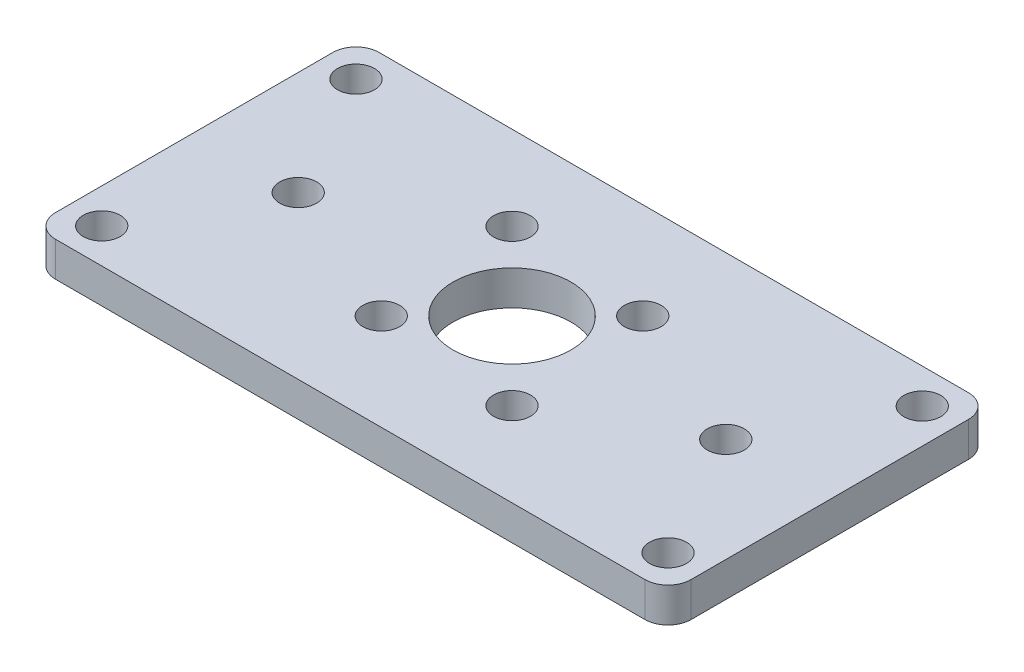
ISO-10303-21;
HEADER;
FILE_DESCRIPTION(('STEP AP214'),'2;1');
FILE_NAME('part.step','',(''),(''),'','','');
FILE_SCHEMA(('AUTOMOTIVE_DESIGN { 1 0 10303 214 1 1 1 1 }'));
ENDSEC;
DATA;
#1=APPLICATION_CONTEXT('core data for automotive mechanical design processes');
#2=APPLICATION_PROTOCOL_DEFINITION('international standard','automotive_design',2000,#1);
#3=PRODUCT_CONTEXT('',#1,'mechanical');
#4=PRODUCT('Part','Part','',(#3));
#5=PRODUCT_RELATED_PRODUCT_CATEGORY('part','',(#4));
#6=PRODUCT_DEFINITION_FORMATION('','',#4);
#7=PRODUCT_DEFINITION_CONTEXT('part definition',#1,'design');
#8=PRODUCT_DEFINITION('design','',#6,#7);
#9=PRODUCT_DEFINITION_SHAPE('','',#8);
#10=(LENGTH_UNIT() NAMED_UNIT(*) SI_UNIT(.MILLI.,.METRE.));
#11=(NAMED_UNIT(*) PLANE_ANGLE_UNIT() SI_UNIT($,.RADIAN.));
#12=(NAMED_UNIT(*) SI_UNIT($,.STERADIAN.) SOLID_ANGLE_UNIT());
#13=UNCERTAINTY_MEASURE_WITH_UNIT(LENGTH_MEASURE(1.E-05),#10,'distance_accuracy_value','');
#14=(GEOMETRIC_REPRESENTATION_CONTEXT(3) GLOBAL_UNCERTAINTY_ASSIGNED_CONTEXT((#13)) GLOBAL_UNIT_ASSIGNED_CONTEXT((#10,
#11,#12)) REPRESENTATION_CONTEXT('',''));
#15=CARTESIAN_POINT('',(0.,0.,0.));
#16=DIRECTION('',(0.,0.,1.));
#17=DIRECTION('',(1.,0.,0.));
#18=AXIS2_PLACEMENT_3D('',#15,#16,#17);
#19=CARTESIAN_POINT('',(0.,3.,0.));
#20=DIRECTION('',(0.,-1.,0.));
#21=DIRECTION('',(0.,0.,-1.));
#22=AXIS2_PLACEMENT_3D('',#19,#20,#21);
#23=PLANE('',#22);
#24=CARTESIAN_POINT('',(24.5,3.,11.));
#25=DIRECTION('',(0.,1.,0.));
#26=DIRECTION('',(0.,0.,-1.));
#27=AXIS2_PLACEMENT_3D('',#24,#25,#26);
#28=CIRCLE('',#27,1.6);
#29=CARTESIAN_POINT('',(24.5,3.,9.39999999999998));
#30=VERTEX_POINT('',#29);
#31=EDGE_CURVE('E276',#30,#30,#28,.T.);
#32=ORIENTED_EDGE('',*,*,#31,.F.);
#33=EDGE_LOOP('',(#32));
#34=FACE_BOUND('',#33,.T.);
#35=CARTESIAN_POINT('',(-24.5,3.,-11.));
#36=DIRECTION('',(0.,1.,0.));
#37=DIRECTION('',(0.,0.,1.));
#38=AXIS2_PLACEMENT_3D('',#35,#36,#37);
#39=CIRCLE('',#38,1.6);
#40=CARTESIAN_POINT('',(-24.5,3.,-9.40000000000001));
#41=VERTEX_POINT('',#40);
#42=EDGE_CURVE('E292',#41,#41,#39,.T.);
#43=ORIENTED_EDGE('',*,*,#42,.F.);
#44=EDGE_LOOP('',(#43));
#45=FACE_BOUND('',#44,.T.);
#46=CARTESIAN_POINT('',(-24.5,3.,11.));
#47=DIRECTION('',(0.,1.,0.));
#48=DIRECTION('',(0.,0.,1.));
#49=AXIS2_PLACEMENT_3D('',#46,#47,#48);
#50=CIRCLE('',#49,1.6);
#51=CARTESIAN_POINT('',(-24.5,3.,12.6));
#52=VERTEX_POINT('',#51);
#53=EDGE_CURVE('E284',#52,#52,#50,.T.);
#54=ORIENTED_EDGE('',*,*,#53,.F.);
#55=EDGE_LOOP('',(#54));
#56=FACE_BOUND('',#55,.T.);
#57=CARTESIAN_POINT('',(18.5,3.,-6.52256026967279E-13));
#58=DIRECTION('',(0.,1.,0.));
#59=DIRECTION('',(0.,0.,1.));
#60=AXIS2_PLACEMENT_3D('',#57,#58,#59);
#61=CIRCLE('',#60,1.59999999999982);
#62=CARTESIAN_POINT('',(18.5,3.,1.59999999999917));
#63=VERTEX_POINT('',#62);
#64=EDGE_CURVE('E285',#63,#63,#61,.T.);
#65=ORIENTED_EDGE('',*,*,#64,.F.);
#66=EDGE_LOOP('',(#65));
#67=FACE_BOUND('',#66,.T.);
#68=CARTESIAN_POINT('',(-18.5,3.,-6.47724833810434E-13));
#69=DIRECTION('',(0.,1.,0.));
#70=DIRECTION('',(0.,0.,-1.));
#71=AXIS2_PLACEMENT_3D('',#68,#69,#70);
#72=CIRCLE('',#71,1.59999999999981);
#73=CARTESIAN_POINT('',(-18.5,3.,-1.60000000000046));
#74=VERTEX_POINT('',#73);
#75=EDGE_CURVE('E306',#74,#74,#72,.T.);
#76=ORIENTED_EDGE('',*,*,#75,.F.);
#77=EDGE_LOOP('',(#76));
#78=FACE_BOUND('',#77,.T.);
#79=CARTESIAN_POINT('',(24.5,3.,-11.));
#80=DIRECTION('',(0.,1.,0.));
#81=DIRECTION('',(0.,0.,-1.));
#82=AXIS2_PLACEMENT_3D('',#79,#80,#81);
#83=CIRCLE('',#82,1.6);
#84=CARTESIAN_POINT('',(24.5,3.,-12.6));
#85=VERTEX_POINT('',#84);
#86=EDGE_CURVE('E272',#85,#85,#83,.T.);
#87=ORIENTED_EDGE('',*,*,#86,.F.);
#88=EDGE_LOOP('',(#87));
#89=FACE_BOUND('',#88,.T.);
#90=DIRECTION('',(1.,0.,0.));
#91=VECTOR('',#90,1.);
#92=CARTESIAN_POINT('',(-27.5,3.,14.));
#93=LINE('',#92,#91);
#94=CARTESIAN_POINT('',(-25.5,3.,14.));
#95=VERTEX_POINT('',#94);
#96=CARTESIAN_POINT('',(25.5,3.,14.));
#97=VERTEX_POINT('',#96);
#98=EDGE_CURVE('E165',#95,#97,#93,.T.);
#99=ORIENTED_EDGE('',*,*,#98,.T.);
#100=CARTESIAN_POINT('',(25.5,3.,12.));
#101=DIRECTION('',(0.,-1.,0.));
#102=DIRECTION('',(0.,0.,-1.));
#103=AXIS2_PLACEMENT_3D('',#100,#101,#102);
#104=CIRCLE('',#103,2.);
#105=CARTESIAN_POINT('',(27.5,3.,12.));
#106=VERTEX_POINT('',#105);
#107=EDGE_CURVE('E194',#97,#106,#104,.F.);
#108=ORIENTED_EDGE('',*,*,#107,.T.);
#109=DIRECTION('',(0.,0.,-1.));
#110=VECTOR('',#109,1.);
#111=CARTESIAN_POINT('',(27.5,3.,14.));
#112=LINE('',#111,#110);
#113=CARTESIAN_POINT('',(27.5,3.,-12.));
#114=VERTEX_POINT('',#113);
#115=EDGE_CURVE('E140',#106,#114,#112,.T.);
#116=ORIENTED_EDGE('',*,*,#115,.T.);
#117=CARTESIAN_POINT('',(25.5,3.,-12.));
#118=DIRECTION('',(0.,-1.,0.));
#119=DIRECTION('',(0.,0.,-1.));
#120=AXIS2_PLACEMENT_3D('',#117,#118,#119);
#121=CIRCLE('',#120,2.);
#122=CARTESIAN_POINT('',(25.5,3.,-14.));
#123=VERTEX_POINT('',#122);
#124=EDGE_CURVE('E188',#114,#123,#121,.F.);
#125=ORIENTED_EDGE('',*,*,#124,.T.);
#126=DIRECTION('',(-1.,0.,0.));
#127=VECTOR('',#126,1.);
#128=CARTESIAN_POINT('',(-27.5,3.,-14.));
#129=LINE('',#128,#127);
#130=CARTESIAN_POINT('',(-25.5,3.,-14.));
#131=VERTEX_POINT('',#130);
#132=EDGE_CURVE('E207',#123,#131,#129,.T.);
#133=ORIENTED_EDGE('',*,*,#132,.T.);
#134=CARTESIAN_POINT('',(-25.5,3.,-12.));
#135=DIRECTION('',(0.,-1.,0.));
#136=DIRECTION('',(0.,0.,-1.));
#137=AXIS2_PLACEMENT_3D('',#134,#135,#136);
#138=CIRCLE('',#137,2.);
#139=CARTESIAN_POINT('',(-27.5,3.,-12.));
#140=VERTEX_POINT('',#139);
#141=EDGE_CURVE('E74',#131,#140,#138,.F.);
#142=ORIENTED_EDGE('',*,*,#141,.T.);
#143=DIRECTION('',(0.,0.,1.));
#144=VECTOR('',#143,1.);
#145=CARTESIAN_POINT('',(-27.5,3.,14.));
#146=LINE('',#145,#144);
#147=CARTESIAN_POINT('',(-27.5,3.,12.));
#148=VERTEX_POINT('',#147);
#149=EDGE_CURVE('E214',#140,#148,#146,.T.);
#150=ORIENTED_EDGE('',*,*,#149,.T.);
#151=CARTESIAN_POINT('',(-25.5,3.,12.));
#152=DIRECTION('',(0.,-1.,0.));
#153=DIRECTION('',(0.,0.,-1.));
#154=AXIS2_PLACEMENT_3D('',#151,#152,#153);
#155=CIRCLE('',#154,2.);
#156=EDGE_CURVE('E191',#148,#95,#155,.F.);
#157=ORIENTED_EDGE('',*,*,#156,.T.);
#158=EDGE_LOOP('',(#99,#108,#116,#125,#133,#142,#150,#157));
#159=FACE_BOUND('',#158,.T.);
#160=CARTESIAN_POINT('',(0.,3.,0.));
#161=DIRECTION('',(0.,1.,0.));
#162=DIRECTION('',(0.,0.,1.));
#163=AXIS2_PLACEMENT_3D('',#160,#161,#162);
#164=CIRCLE('',#163,5.1);
#165=CARTESIAN_POINT('',(0.,3.,5.1));
#166=VERTEX_POINT('',#165);
#167=EDGE_CURVE('E151',#166,#166,#164,.T.);
#168=ORIENTED_EDGE('',*,*,#167,.F.);
#169=EDGE_LOOP('',(#168));
#170=FACE_BOUND('',#169,.T.);
#171=CARTESIAN_POINT('',(-5.65685424949237,3.,5.65685424949239));
#172=DIRECTION('',(0.,1.,0.));
#173=DIRECTION('',(0.,0.,1.));
#174=AXIS2_PLACEMENT_3D('',#171,#172,#173);
#175=CIRCLE('',#174,1.6);
#176=CARTESIAN_POINT('',(-5.65685424949237,3.,7.25685424949239));
#177=VERTEX_POINT('',#176);
#178=EDGE_CURVE('E238',#177,#177,#175,.T.);
#179=ORIENTED_EDGE('',*,*,#178,.F.);
#180=EDGE_LOOP('',(#179));
#181=FACE_BOUND('',#180,.T.);
#182=CARTESIAN_POINT('',(5.65685424949237,3.,-5.65685424949239));
#183=DIRECTION('',(0.,1.,0.));
#184=DIRECTION('',(0.,0.,1.));
#185=AXIS2_PLACEMENT_3D('',#182,#183,#184);
#186=CIRCLE('',#185,1.6);
#187=CARTESIAN_POINT('',(5.65685424949237,3.,-4.05685424949239));
#188=VERTEX_POINT('',#187);
#189=EDGE_CURVE('E244',#188,#188,#186,.T.);
#190=ORIENTED_EDGE('',*,*,#189,.F.);
#191=EDGE_LOOP('',(#190));
#192=FACE_BOUND('',#191,.T.);
#193=CARTESIAN_POINT('',(6.71751442127224,3.,6.71751442127216));
#194=DIRECTION('',(0.,1.,0.));
#195=DIRECTION('',(0.,0.,1.));
#196=AXIS2_PLACEMENT_3D('',#193,#194,#195);
#197=CIRCLE('',#196,1.6);
#198=CARTESIAN_POINT('',(6.71751442127224,3.,8.31751442127216));
#199=VERTEX_POINT('',#198);
#200=EDGE_CURVE('E252',#199,#199,#197,.T.);
#201=ORIENTED_EDGE('',*,*,#200,.F.);
#202=EDGE_LOOP('',(#201));
#203=FACE_BOUND('',#202,.T.);
#204=CARTESIAN_POINT('',(-6.71751442127224,3.,-6.71751442127216));
#205=DIRECTION('',(0.,1.,0.));
#206=DIRECTION('',(0.,0.,1.));
#207=AXIS2_PLACEMENT_3D('',#204,#205,#206);
#208=CIRCLE('',#207,1.6);
#209=CARTESIAN_POINT('',(-6.71751442127224,3.,-5.11751442127216));
#210=VERTEX_POINT('',#209);
#211=EDGE_CURVE('E260',#210,#210,#208,.T.);
#212=ORIENTED_EDGE('',*,*,#211,.F.);
#213=EDGE_LOOP('',(#212));
#214=FACE_BOUND('',#213,.T.);
#215=ADVANCED_FACE('F51',(#34,#45,#56,#67,#78,#89,#159,#170,#181,#192,#203,#214),#23,.F.);
#216=CARTESIAN_POINT('',(0.,0.,0.));
#217=DIRECTION('',(0.,-1.,0.));
#218=DIRECTION('',(0.,0.,-1.));
#219=AXIS2_PLACEMENT_3D('',#216,#217,#218);
#220=PLANE('',#219);
#221=CARTESIAN_POINT('',(24.5,0.,11.));
#222=DIRECTION('',(0.,1.,0.));
#223=DIRECTION('',(0.,0.,-1.));
#224=AXIS2_PLACEMENT_3D('',#221,#222,#223);
#225=CIRCLE('',#224,1.6);
#226=CARTESIAN_POINT('',(24.5,0.,9.39999999999998));
#227=VERTEX_POINT('',#226);
#228=EDGE_CURVE('E296',#227,#227,#225,.T.);
#229=ORIENTED_EDGE('',*,*,#228,.T.);
#230=EDGE_LOOP('',(#229));
#231=FACE_BOUND('',#230,.T.);
#232=CARTESIAN_POINT('',(-24.5,0.,-11.));
#233=DIRECTION('',(0.,1.,0.));
#234=DIRECTION('',(0.,0.,1.));
#235=AXIS2_PLACEMENT_3D('',#232,#233,#234);
#236=CIRCLE('',#235,1.6);
#237=CARTESIAN_POINT('',(-24.5,0.,-9.40000000000001));
#238=VERTEX_POINT('',#237);
#239=EDGE_CURVE('E288',#238,#238,#236,.T.);
#240=ORIENTED_EDGE('',*,*,#239,.T.);
#241=EDGE_LOOP('',(#240));
#242=FACE_BOUND('',#241,.T.);
#243=CARTESIAN_POINT('',(-24.5,0.,11.));
#244=DIRECTION('',(0.,1.,0.));
#245=DIRECTION('',(0.,0.,1.));
#246=AXIS2_PLACEMENT_3D('',#243,#244,#245);
#247=CIRCLE('',#246,1.6);
#248=CARTESIAN_POINT('',(-24.5,0.,12.6));
#249=VERTEX_POINT('',#248);
#250=EDGE_CURVE('E280',#249,#249,#247,.T.);
#251=ORIENTED_EDGE('',*,*,#250,.T.);
#252=EDGE_LOOP('',(#251));
#253=FACE_BOUND('',#252,.T.);
#254=CARTESIAN_POINT('',(18.5,0.,-6.52256026967279E-13));
#255=DIRECTION('',(0.,1.,0.));
#256=DIRECTION('',(0.,0.,1.));
#257=AXIS2_PLACEMENT_3D('',#254,#255,#256);
#258=CIRCLE('',#257,1.59999999999982);
#259=CARTESIAN_POINT('',(18.5,0.,1.59999999999917));
#260=VERTEX_POINT('',#259);
#261=EDGE_CURVE('E310',#260,#260,#258,.T.);
#262=ORIENTED_EDGE('',*,*,#261,.T.);
#263=EDGE_LOOP('',(#262));
#264=FACE_BOUND('',#263,.T.);
#265=CARTESIAN_POINT('',(-18.5,0.,-6.47724833810434E-13));
#266=DIRECTION('',(0.,1.,0.));
#267=DIRECTION('',(0.,0.,-1.));
#268=AXIS2_PLACEMENT_3D('',#265,#266,#267);
#269=CIRCLE('',#268,1.59999999999981);
#270=CARTESIAN_POINT('',(-18.5,0.,-1.60000000000046));
#271=VERTEX_POINT('',#270);
#272=EDGE_CURVE('E302',#271,#271,#269,.T.);
#273=ORIENTED_EDGE('',*,*,#272,.T.);
#274=EDGE_LOOP('',(#273));
#275=FACE_BOUND('',#274,.T.);
#276=CARTESIAN_POINT('',(24.5,0.,-11.));
#277=DIRECTION('',(0.,1.,0.));
#278=DIRECTION('',(0.,0.,-1.));
#279=AXIS2_PLACEMENT_3D('',#276,#277,#278);
#280=CIRCLE('',#279,1.6);
#281=CARTESIAN_POINT('',(24.5,0.,-12.6));
#282=VERTEX_POINT('',#281);
#283=EDGE_CURVE('E268',#282,#282,#280,.T.);
#284=ORIENTED_EDGE('',*,*,#283,.T.);
#285=EDGE_LOOP('',(#284));
#286=FACE_BOUND('',#285,.T.);
#287=CARTESIAN_POINT('',(6.71751442127224,0.,6.71751442127216));
#288=DIRECTION('',(0.,1.,0.));
#289=DIRECTION('',(0.,0.,1.));
#290=AXIS2_PLACEMENT_3D('',#287,#288,#289);
#291=CIRCLE('',#290,1.6);
#292=CARTESIAN_POINT('',(6.71751442127224,0.,8.31751442127216));
#293=VERTEX_POINT('',#292);
#294=EDGE_CURVE('E256',#293,#293,#291,.T.);
#295=ORIENTED_EDGE('',*,*,#294,.T.);
#296=EDGE_LOOP('',(#295));
#297=FACE_BOUND('',#296,.T.);
#298=CARTESIAN_POINT('',(-5.65685424949237,0.,5.65685424949239));
#299=DIRECTION('',(0.,1.,0.));
#300=DIRECTION('',(0.,0.,1.));
#301=AXIS2_PLACEMENT_3D('',#298,#299,#300);
#302=CIRCLE('',#301,1.6);
#303=CARTESIAN_POINT('',(-5.65685424949237,0.,7.25685424949239));
#304=VERTEX_POINT('',#303);
#305=EDGE_CURVE('E240',#304,#304,#302,.T.);
#306=ORIENTED_EDGE('',*,*,#305,.T.);
#307=EDGE_LOOP('',(#306));
#308=FACE_BOUND('',#307,.T.);
#309=DIRECTION('',(0.,0.,-1.));
#310=VECTOR('',#309,1.);
#311=CARTESIAN_POINT('',(27.5,0.,14.));
#312=LINE('',#311,#310);
#313=CARTESIAN_POINT('',(27.5,0.,12.));
#314=VERTEX_POINT('',#313);
#315=CARTESIAN_POINT('',(27.5,0.,-12.));
#316=VERTEX_POINT('',#315);
#317=EDGE_CURVE('E137',#314,#316,#312,.T.);
#318=ORIENTED_EDGE('',*,*,#317,.F.);
#319=CARTESIAN_POINT('',(25.5,0.,12.));
#320=DIRECTION('',(0.,-1.,0.));
#321=DIRECTION('',(0.,0.,-1.));
#322=AXIS2_PLACEMENT_3D('',#319,#320,#321);
#323=CIRCLE('',#322,2.);
#324=CARTESIAN_POINT('',(25.5,0.,14.));
#325=VERTEX_POINT('',#324);
#326=EDGE_CURVE('E119',#314,#325,#323,.T.);
#327=ORIENTED_EDGE('',*,*,#326,.T.);
#328=DIRECTION('',(1.,0.,0.));
#329=VECTOR('',#328,1.);
#330=CARTESIAN_POINT('',(-27.5,0.,14.));
#331=LINE('',#330,#329);
#332=CARTESIAN_POINT('',(-25.5,0.,14.));
#333=VERTEX_POINT('',#332);
#334=EDGE_CURVE('E170',#333,#325,#331,.T.);
#335=ORIENTED_EDGE('',*,*,#334,.F.);
#336=CARTESIAN_POINT('',(-25.5,0.,12.));
#337=DIRECTION('',(0.,-1.,0.));
#338=DIRECTION('',(0.,0.,-1.));
#339=AXIS2_PLACEMENT_3D('',#336,#337,#338);
#340=CIRCLE('',#339,2.);
#341=CARTESIAN_POINT('',(-27.5,0.,12.));
#342=VERTEX_POINT('',#341);
#343=EDGE_CURVE('E131',#333,#342,#340,.T.);
#344=ORIENTED_EDGE('',*,*,#343,.T.);
#345=DIRECTION('',(0.,0.,1.));
#346=VECTOR('',#345,1.);
#347=CARTESIAN_POINT('',(-27.5,0.,14.));
#348=LINE('',#347,#346);
#349=CARTESIAN_POINT('',(-27.5,0.,-12.));
#350=VERTEX_POINT('',#349);
#351=EDGE_CURVE('E158',#350,#342,#348,.T.);
#352=ORIENTED_EDGE('',*,*,#351,.F.);
#353=CARTESIAN_POINT('',(-25.5,0.,-12.));
#354=DIRECTION('',(0.,-1.,0.));
#355=DIRECTION('',(0.,0.,-1.));
#356=AXIS2_PLACEMENT_3D('',#353,#354,#355);
#357=CIRCLE('',#356,2.);
#358=CARTESIAN_POINT('',(-25.5,0.,-14.));
#359=VERTEX_POINT('',#358);
#360=EDGE_CURVE('E142',#350,#359,#357,.T.);
#361=ORIENTED_EDGE('',*,*,#360,.T.);
#362=DIRECTION('',(-1.,0.,0.));
#363=VECTOR('',#362,1.);
#364=CARTESIAN_POINT('',(-27.5,0.,-14.));
#365=LINE('',#364,#363);
#366=CARTESIAN_POINT('',(25.5,0.,-14.));
#367=VERTEX_POINT('',#366);
#368=EDGE_CURVE('E150',#367,#359,#365,.T.);
#369=ORIENTED_EDGE('',*,*,#368,.F.);
#370=CARTESIAN_POINT('',(25.5,0.,-12.));
#371=DIRECTION('',(0.,-1.,0.));
#372=DIRECTION('',(0.,0.,-1.));
#373=AXIS2_PLACEMENT_3D('',#370,#371,#372);
#374=CIRCLE('',#373,2.);
#375=EDGE_CURVE('E148',#367,#316,#374,.T.);
#376=ORIENTED_EDGE('',*,*,#375,.T.);
#377=EDGE_LOOP('',(#318,#327,#335,#344,#352,#361,#369,#376));
#378=FACE_BOUND('',#377,.T.);
#379=CARTESIAN_POINT('',(0.,0.,0.));
#380=DIRECTION('',(0.,1.,0.));
#381=DIRECTION('',(0.,0.,1.));
#382=AXIS2_PLACEMENT_3D('',#379,#380,#381);
#383=CIRCLE('',#382,5.1);
#384=CARTESIAN_POINT('',(0.,0.,5.1));
#385=VERTEX_POINT('',#384);
#386=EDGE_CURVE('E162',#385,#385,#383,.T.);
#387=ORIENTED_EDGE('',*,*,#386,.T.);
#388=EDGE_LOOP('',(#387));
#389=FACE_BOUND('',#388,.T.);
#390=CARTESIAN_POINT('',(5.65685424949237,0.,-5.65685424949239));
#391=DIRECTION('',(0.,1.,0.));
#392=DIRECTION('',(0.,0.,1.));
#393=AXIS2_PLACEMENT_3D('',#390,#391,#392);
#394=CIRCLE('',#393,1.6);
#395=CARTESIAN_POINT('',(5.65685424949237,0.,-4.05685424949239));
#396=VERTEX_POINT('',#395);
#397=EDGE_CURVE('E248',#396,#396,#394,.T.);
#398=ORIENTED_EDGE('',*,*,#397,.T.);
#399=EDGE_LOOP('',(#398));
#400=FACE_BOUND('',#399,.T.);
#401=CARTESIAN_POINT('',(-6.71751442127224,0.,-6.71751442127216));
#402=DIRECTION('',(0.,1.,0.));
#403=DIRECTION('',(0.,0.,1.));
#404=AXIS2_PLACEMENT_3D('',#401,#402,#403);
#405=CIRCLE('',#404,1.6);
#406=CARTESIAN_POINT('',(-6.71751442127224,0.,-5.11751442127216));
#407=VERTEX_POINT('',#406);
#408=EDGE_CURVE('E264',#407,#407,#405,.T.);
#409=ORIENTED_EDGE('',*,*,#408,.T.);
#410=EDGE_LOOP('',(#409));
#411=FACE_BOUND('',#410,.T.);
#412=ADVANCED_FACE('F145',(#231,#242,#253,#264,#275,#286,#297,#308,#378,#389,#400,#411),#220,.T.);
#413=CARTESIAN_POINT('',(27.5,3.,14.));
#414=DIRECTION('',(-1.,0.,0.));
#415=DIRECTION('',(0.,0.,1.));
#416=AXIS2_PLACEMENT_3D('',#413,#414,#415);
#417=PLANE('',#416);
#418=ORIENTED_EDGE('',*,*,#115,.F.);
#419=DIRECTION('',(0.,-1.,0.));
#420=VECTOR('',#419,1.);
#421=CARTESIAN_POINT('',(27.5,3.,12.));
#422=LINE('',#421,#420);
#423=EDGE_CURVE('E123',#106,#314,#422,.T.);
#424=ORIENTED_EDGE('',*,*,#423,.T.);
#425=ORIENTED_EDGE('',*,*,#317,.T.);
#426=DIRECTION('',(0.,-1.,0.));
#427=VECTOR('',#426,1.);
#428=CARTESIAN_POINT('',(27.5,3.,-12.));
#429=LINE('',#428,#427);
#430=EDGE_CURVE('E143',#316,#114,#429,.F.);
#431=ORIENTED_EDGE('',*,*,#430,.T.);
#432=EDGE_LOOP('',(#418,#424,#425,#431));
#433=FACE_BOUND('',#432,.T.);
#434=ADVANCED_FACE('F136',(#433),#417,.F.);
#435=CARTESIAN_POINT('',(-27.5,3.,-14.));
#436=DIRECTION('',(0.,0.,1.));
#437=DIRECTION('',(1.,0.,0.));
#438=AXIS2_PLACEMENT_3D('',#435,#436,#437);
#439=PLANE('',#438);
#440=ORIENTED_EDGE('',*,*,#132,.F.);
#441=DIRECTION('',(0.,-1.,0.));
#442=VECTOR('',#441,1.);
#443=CARTESIAN_POINT('',(25.5,3.,-14.));
#444=LINE('',#443,#442);
#445=EDGE_CURVE('E11',#123,#367,#444,.T.);
#446=ORIENTED_EDGE('',*,*,#445,.T.);
#447=ORIENTED_EDGE('',*,*,#368,.T.);
#448=DIRECTION('',(0.,-1.,0.));
#449=VECTOR('',#448,1.);
#450=CARTESIAN_POINT('',(-25.5,3.,-14.));
#451=LINE('',#450,#449);
#452=EDGE_CURVE('E60',#359,#131,#451,.F.);
#453=ORIENTED_EDGE('',*,*,#452,.T.);
#454=EDGE_LOOP('',(#440,#446,#447,#453));
#455=FACE_BOUND('',#454,.T.);
#456=ADVANCED_FACE('F206',(#455),#439,.F.);
#457=CARTESIAN_POINT('',(-27.5,3.,14.));
#458=DIRECTION('',(1.,0.,0.));
#459=DIRECTION('',(0.,0.,-1.));
#460=AXIS2_PLACEMENT_3D('',#457,#458,#459);
#461=PLANE('',#460);
#462=ORIENTED_EDGE('',*,*,#351,.T.);
#463=DIRECTION('',(0.,-1.,0.));
#464=VECTOR('',#463,1.);
#465=CARTESIAN_POINT('',(-27.5,3.,12.));
#466=LINE('',#465,#464);
#467=EDGE_CURVE('E67',#342,#148,#466,.F.);
#468=ORIENTED_EDGE('',*,*,#467,.T.);
#469=ORIENTED_EDGE('',*,*,#149,.F.);
#470=DIRECTION('',(0.,-1.,0.));
#471=VECTOR('',#470,1.);
#472=CARTESIAN_POINT('',(-27.5,3.,-12.));
#473=LINE('',#472,#471);
#474=EDGE_CURVE('E197',#140,#350,#473,.T.);
#475=ORIENTED_EDGE('',*,*,#474,.T.);
#476=EDGE_LOOP('',(#462,#468,#469,#475));
#477=FACE_BOUND('',#476,.T.);
#478=ADVANCED_FACE('F218',(#477),#461,.F.);
#479=CARTESIAN_POINT('',(-27.5,3.,14.));
#480=DIRECTION('',(0.,0.,-1.));
#481=DIRECTION('',(-1.,0.,0.));
#482=AXIS2_PLACEMENT_3D('',#479,#480,#481);
#483=PLANE('',#482);
#484=ORIENTED_EDGE('',*,*,#334,.T.);
#485=DIRECTION('',(0.,-1.,0.));
#486=VECTOR('',#485,1.);
#487=CARTESIAN_POINT('',(25.5,3.,14.));
#488=LINE('',#487,#486);
#489=EDGE_CURVE('E124',#325,#97,#488,.F.);
#490=ORIENTED_EDGE('',*,*,#489,.T.);
#491=ORIENTED_EDGE('',*,*,#98,.F.);
#492=DIRECTION('',(0.,-1.,0.));
#493=VECTOR('',#492,1.);
#494=CARTESIAN_POINT('',(-25.5,3.,14.));
#495=LINE('',#494,#493);
#496=EDGE_CURVE('E130',#95,#333,#495,.T.);
#497=ORIENTED_EDGE('',*,*,#496,.T.);
#498=EDGE_LOOP('',(#484,#490,#491,#497));
#499=FACE_BOUND('',#498,.T.);
#500=ADVANCED_FACE('F225',(#499),#483,.F.);
#501=CARTESIAN_POINT('',(0.,3.,0.));
#502=DIRECTION('',(0.,-1.,0.));
#503=DIRECTION('',(0.,0.,-1.));
#504=AXIS2_PLACEMENT_3D('',#501,#502,#503);
#505=CYLINDRICAL_SURFACE('',#504,5.1);
#506=ORIENTED_EDGE('',*,*,#167,.T.);
#507=EDGE_LOOP('',(#506));
#508=FACE_BOUND('',#507,.T.);
#509=ORIENTED_EDGE('',*,*,#386,.F.);
#510=EDGE_LOOP('',(#509));
#511=FACE_BOUND('',#510,.T.);
#512=ADVANCED_FACE('F356',(#508,#511),#505,.F.);
#513=CARTESIAN_POINT('',(-5.65685424949237,3.,5.65685424949239));
#514=DIRECTION('',(0.,-1.,0.));
#515=DIRECTION('',(0.,0.,-1.));
#516=AXIS2_PLACEMENT_3D('',#513,#514,#515);
#517=CYLINDRICAL_SURFACE('',#516,1.6);
#518=ORIENTED_EDGE('',*,*,#178,.T.);
#519=EDGE_LOOP('',(#518));
#520=FACE_BOUND('',#519,.T.);
#521=ORIENTED_EDGE('',*,*,#305,.F.);
#522=EDGE_LOOP('',(#521));
#523=FACE_BOUND('',#522,.T.);
#524=ADVANCED_FACE('F352',(#520,#523),#517,.F.);
#525=CARTESIAN_POINT('',(5.65685424949237,3.,-5.65685424949239));
#526=DIRECTION('',(0.,-1.,0.));
#527=DIRECTION('',(0.,0.,-1.));
#528=AXIS2_PLACEMENT_3D('',#525,#526,#527);
#529=CYLINDRICAL_SURFACE('',#528,1.6);
#530=ORIENTED_EDGE('',*,*,#189,.T.);
#531=EDGE_LOOP('',(#530));
#532=FACE_BOUND('',#531,.T.);
#533=ORIENTED_EDGE('',*,*,#397,.F.);
#534=EDGE_LOOP('',(#533));
#535=FACE_BOUND('',#534,.T.);
#536=ADVANCED_FACE('F348',(#532,#535),#529,.F.);
#537=CARTESIAN_POINT('',(6.71751442127224,3.,6.71751442127216));
#538=DIRECTION('',(0.,-1.,0.));
#539=DIRECTION('',(0.,0.,-1.));
#540=AXIS2_PLACEMENT_3D('',#537,#538,#539);
#541=CYLINDRICAL_SURFACE('',#540,1.6);
#542=ORIENTED_EDGE('',*,*,#200,.T.);
#543=EDGE_LOOP('',(#542));
#544=FACE_BOUND('',#543,.T.);
#545=ORIENTED_EDGE('',*,*,#294,.F.);
#546=EDGE_LOOP('',(#545));
#547=FACE_BOUND('',#546,.T.);
#548=ADVANCED_FACE('F338',(#544,#547),#541,.F.);
#549=CARTESIAN_POINT('',(-6.71751442127224,3.,-6.71751442127216));
#550=DIRECTION('',(0.,-1.,0.));
#551=DIRECTION('',(0.,0.,-1.));
#552=AXIS2_PLACEMENT_3D('',#549,#550,#551);
#553=CYLINDRICAL_SURFACE('',#552,1.6);
#554=ORIENTED_EDGE('',*,*,#211,.T.);
#555=EDGE_LOOP('',(#554));
#556=FACE_BOUND('',#555,.T.);
#557=ORIENTED_EDGE('',*,*,#408,.F.);
#558=EDGE_LOOP('',(#557));
#559=FACE_BOUND('',#558,.T.);
#560=ADVANCED_FACE('F330',(#556,#559),#553,.F.);
#561=CARTESIAN_POINT('',(24.5,0.,-11.));
#562=DIRECTION('',(0.,1.,0.));
#563=DIRECTION('',(0.,0.,1.));
#564=AXIS2_PLACEMENT_3D('',#561,#562,#563);
#565=CYLINDRICAL_SURFACE('',#564,1.6);
#566=ORIENTED_EDGE('',*,*,#283,.F.);
#567=EDGE_LOOP('',(#566));
#568=FACE_BOUND('',#567,.T.);
#569=ORIENTED_EDGE('',*,*,#86,.T.);
#570=EDGE_LOOP('',(#569));
#571=FACE_BOUND('',#570,.T.);
#572=ADVANCED_FACE('F327',(#568,#571),#565,.F.);
#573=CARTESIAN_POINT('',(-18.5,0.,-6.47724833810434E-13));
#574=DIRECTION('',(0.,1.,0.));
#575=DIRECTION('',(0.,0.,1.));
#576=AXIS2_PLACEMENT_3D('',#573,#574,#575);
#577=CYLINDRICAL_SURFACE('',#576,1.59999999999981);
#578=ORIENTED_EDGE('',*,*,#272,.F.);
#579=EDGE_LOOP('',(#578));
#580=FACE_BOUND('',#579,.T.);
#581=ORIENTED_EDGE('',*,*,#75,.T.);
#582=EDGE_LOOP('',(#581));
#583=FACE_BOUND('',#582,.T.);
#584=ADVANCED_FACE('F329',(#580,#583),#577,.F.);
#585=CARTESIAN_POINT('',(18.5,0.,-6.52256026967279E-13));
#586=DIRECTION('',(0.,1.,0.));
#587=DIRECTION('',(0.,0.,1.));
#588=AXIS2_PLACEMENT_3D('',#585,#586,#587);
#589=CYLINDRICAL_SURFACE('',#588,1.59999999999982);
#590=ORIENTED_EDGE('',*,*,#261,.F.);
#591=EDGE_LOOP('',(#590));
#592=FACE_BOUND('',#591,.T.);
#593=ORIENTED_EDGE('',*,*,#64,.T.);
#594=EDGE_LOOP('',(#593));
#595=FACE_BOUND('',#594,.T.);
#596=ADVANCED_FACE('F317',(#592,#595),#589,.F.);
#597=CARTESIAN_POINT('',(-24.5,0.,11.));
#598=DIRECTION('',(0.,1.,0.));
#599=DIRECTION('',(0.,0.,1.));
#600=AXIS2_PLACEMENT_3D('',#597,#598,#599);
#601=CYLINDRICAL_SURFACE('',#600,1.6);
#602=ORIENTED_EDGE('',*,*,#250,.F.);
#603=EDGE_LOOP('',(#602));
#604=FACE_BOUND('',#603,.T.);
#605=ORIENTED_EDGE('',*,*,#53,.T.);
#606=EDGE_LOOP('',(#605));
#607=FACE_BOUND('',#606,.T.);
#608=ADVANCED_FACE('F343',(#604,#607),#601,.F.);
#609=CARTESIAN_POINT('',(-24.5,0.,-11.));
#610=DIRECTION('',(0.,1.,0.));
#611=DIRECTION('',(0.,0.,1.));
#612=AXIS2_PLACEMENT_3D('',#609,#610,#611);
#613=CYLINDRICAL_SURFACE('',#612,1.6);
#614=ORIENTED_EDGE('',*,*,#239,.F.);
#615=EDGE_LOOP('',(#614));
#616=FACE_BOUND('',#615,.T.);
#617=ORIENTED_EDGE('',*,*,#42,.T.);
#618=EDGE_LOOP('',(#617));
#619=FACE_BOUND('',#618,.T.);
#620=ADVANCED_FACE('F446',(#616,#619),#613,.F.);
#621=CARTESIAN_POINT('',(24.5,0.,11.));
#622=DIRECTION('',(0.,1.,0.));
#623=DIRECTION('',(0.,0.,1.));
#624=AXIS2_PLACEMENT_3D('',#621,#622,#623);
#625=CYLINDRICAL_SURFACE('',#624,1.6);
#626=ORIENTED_EDGE('',*,*,#228,.F.);
#627=EDGE_LOOP('',(#626));
#628=FACE_BOUND('',#627,.T.);
#629=ORIENTED_EDGE('',*,*,#31,.T.);
#630=EDGE_LOOP('',(#629));
#631=FACE_BOUND('',#630,.T.);
#632=ADVANCED_FACE('F374',(#628,#631),#625,.F.);
#633=CARTESIAN_POINT('',(25.5,3.,12.));
#634=DIRECTION('',(0.,-1.,0.));
#635=DIRECTION('',(0.,0.,-1.));
#636=AXIS2_PLACEMENT_3D('',#633,#634,#635);
#637=CYLINDRICAL_SURFACE('',#636,2.);
#638=ORIENTED_EDGE('',*,*,#107,.F.);
#639=ORIENTED_EDGE('',*,*,#489,.F.);
#640=ORIENTED_EDGE('',*,*,#326,.F.);
#641=ORIENTED_EDGE('',*,*,#423,.F.);
#642=EDGE_LOOP('',(#638,#639,#640,#641));
#643=FACE_BOUND('',#642,.T.);
#644=ADVANCED_FACE('F122',(#643),#637,.T.);
#645=CARTESIAN_POINT('',(-25.5,3.,12.));
#646=DIRECTION('',(0.,-1.,0.));
#647=DIRECTION('',(0.,0.,-1.));
#648=AXIS2_PLACEMENT_3D('',#645,#646,#647);
#649=CYLINDRICAL_SURFACE('',#648,2.);
#650=ORIENTED_EDGE('',*,*,#156,.F.);
#651=ORIENTED_EDGE('',*,*,#467,.F.);
#652=ORIENTED_EDGE('',*,*,#343,.F.);
#653=ORIENTED_EDGE('',*,*,#496,.F.);
#654=EDGE_LOOP('',(#650,#651,#652,#653));
#655=FACE_BOUND('',#654,.T.);
#656=ADVANCED_FACE('F222',(#655),#649,.T.);
#657=CARTESIAN_POINT('',(25.5,3.,-12.));
#658=DIRECTION('',(0.,-1.,0.));
#659=DIRECTION('',(0.,0.,-1.));
#660=AXIS2_PLACEMENT_3D('',#657,#658,#659);
#661=CYLINDRICAL_SURFACE('',#660,2.);
#662=ORIENTED_EDGE('',*,*,#124,.F.);
#663=ORIENTED_EDGE('',*,*,#430,.F.);
#664=ORIENTED_EDGE('',*,*,#375,.F.);
#665=ORIENTED_EDGE('',*,*,#445,.F.);
#666=EDGE_LOOP('',(#662,#663,#664,#665));
#667=FACE_BOUND('',#666,.T.);
#668=ADVANCED_FACE('F376',(#667),#661,.T.);
#669=CARTESIAN_POINT('',(-25.5,3.,-12.));
#670=DIRECTION('',(0.,-1.,0.));
#671=DIRECTION('',(0.,0.,-1.));
#672=AXIS2_PLACEMENT_3D('',#669,#670,#671);
#673=CYLINDRICAL_SURFACE('',#672,2.);
#674=ORIENTED_EDGE('',*,*,#141,.F.);
#675=ORIENTED_EDGE('',*,*,#452,.F.);
#676=ORIENTED_EDGE('',*,*,#360,.F.);
#677=ORIENTED_EDGE('',*,*,#474,.F.);
#678=EDGE_LOOP('',(#674,#675,#676,#677));
#679=FACE_BOUND('',#678,.T.);
#680=ADVANCED_FACE('F53',(#679),#673,.T.);
#681=CLOSED_SHELL('',(#215,#412,#434,#456,#478,#500,#512,#524,#536,#548,#560,#572,#584,#596,
#608,#620,#632,#644,#656,#668,#680));
#682=MANIFOLD_SOLID_BREP('B2',#681);
#683=ADVANCED_BREP_SHAPE_REPRESENTATION('',(#18,#682),#14);
#684=SHAPE_DEFINITION_REPRESENTATION(#9,#683);
ENDSEC;
END-ISO-10303-21;
